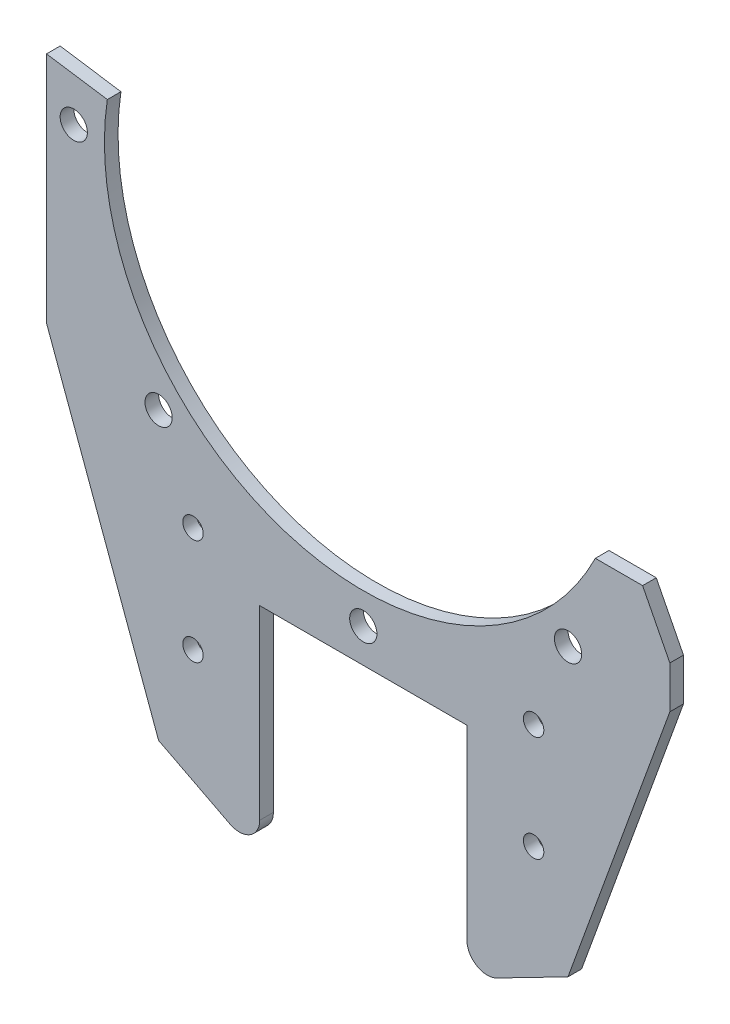
ISO-10303-21;
HEADER;
FILE_DESCRIPTION(('STEP AP214'),'2;1');
FILE_NAME('part.step','',(''),(''),'','','');
FILE_SCHEMA(('AUTOMOTIVE_DESIGN { 1 0 10303 214 1 1 1 1 }'));
ENDSEC;
DATA;
#1=APPLICATION_CONTEXT('core data for automotive mechanical design processes');
#2=APPLICATION_PROTOCOL_DEFINITION('international standard','automotive_design',2000,#1);
#3=PRODUCT_CONTEXT('',#1,'mechanical');
#4=PRODUCT('Part','Part','',(#3));
#5=PRODUCT_RELATED_PRODUCT_CATEGORY('part','',(#4));
#6=PRODUCT_DEFINITION_FORMATION('','',#4);
#7=PRODUCT_DEFINITION_CONTEXT('part definition',#1,'design');
#8=PRODUCT_DEFINITION('design','',#6,#7);
#9=PRODUCT_DEFINITION_SHAPE('','',#8);
#10=(LENGTH_UNIT() NAMED_UNIT(*) SI_UNIT(.MILLI.,.METRE.));
#11=(NAMED_UNIT(*) PLANE_ANGLE_UNIT() SI_UNIT($,.RADIAN.));
#12=(NAMED_UNIT(*) SI_UNIT($,.STERADIAN.) SOLID_ANGLE_UNIT());
#13=UNCERTAINTY_MEASURE_WITH_UNIT(LENGTH_MEASURE(1.E-05),#10,'distance_accuracy_value','');
#14=(GEOMETRIC_REPRESENTATION_CONTEXT(3) GLOBAL_UNCERTAINTY_ASSIGNED_CONTEXT((#13)) GLOBAL_UNIT_ASSIGNED_CONTEXT((#10,
#11,#12)) REPRESENTATION_CONTEXT('',''));
#15=CARTESIAN_POINT('',(0.,0.,0.));
#16=DIRECTION('',(0.,0.,1.));
#17=DIRECTION('',(1.,0.,0.));
#18=AXIS2_PLACEMENT_3D('',#15,#16,#17);
#19=CARTESIAN_POINT('',(0.,56.,2.));
#20=DIRECTION('',(0.,0.,1.));
#21=DIRECTION('',(1.,0.,0.));
#22=AXIS2_PLACEMENT_3D('',#19,#20,#21);
#23=PLANE('',#22);
#24=CARTESIAN_POINT('',(-42.5,56.,2.));
#25=DIRECTION('',(0.,0.,1.));
#26=DIRECTION('',(1.,0.,0.));
#27=AXIS2_PLACEMENT_3D('',#24,#25,#26);
#28=CIRCLE('',#27,2.);
#29=CARTESIAN_POINT('',(-40.5,56.,2.));
#30=VERTEX_POINT('',#29);
#31=EDGE_CURVE('E346',#30,#30,#28,.T.);
#32=ORIENTED_EDGE('',*,*,#31,.F.);
#33=EDGE_LOOP('',(#32));
#34=FACE_BOUND('',#33,.T.);
#35=CARTESIAN_POINT('',(24.9999999999944,-1.99021668527465,2.));
#36=DIRECTION('',(0.,0.,1.));
#37=DIRECTION('',(-1.,0.,0.));
#38=AXIS2_PLACEMENT_3D('',#35,#36,#37);
#39=CIRCLE('',#38,1.5);
#40=CARTESIAN_POINT('',(23.4999999999944,-1.99021668527465,2.));
#41=VERTEX_POINT('',#40);
#42=EDGE_CURVE('E358',#41,#41,#39,.T.);
#43=ORIENTED_EDGE('',*,*,#42,.F.);
#44=EDGE_LOOP('',(#43));
#45=FACE_BOUND('',#44,.T.);
#46=CARTESIAN_POINT('',(-30.0451203522419,25.9548796477583,2.));
#47=DIRECTION('',(0.,0.,1.));
#48=DIRECTION('',(1.,0.,0.));
#49=AXIS2_PLACEMENT_3D('',#46,#47,#48);
#50=CIRCLE('',#49,2.);
#51=CARTESIAN_POINT('',(-28.0451203522419,25.9548796477583,2.));
#52=VERTEX_POINT('',#51);
#53=EDGE_CURVE('E370',#52,#52,#50,.T.);
#54=ORIENTED_EDGE('',*,*,#53,.F.);
#55=EDGE_LOOP('',(#54));
#56=FACE_BOUND('',#55,.T.);
#57=CARTESIAN_POINT('',(-24.9999999999944,-1.99021668527465,2.));
#58=DIRECTION('',(0.,0.,1.));
#59=DIRECTION('',(1.,0.,0.));
#60=AXIS2_PLACEMENT_3D('',#57,#58,#59);
#61=CIRCLE('',#60,1.5);
#62=CARTESIAN_POINT('',(-23.4999999999944,-1.99021668527465,2.));
#63=VERTEX_POINT('',#62);
#64=EDGE_CURVE('E176',#63,#63,#61,.T.);
#65=ORIENTED_EDGE('',*,*,#64,.F.);
#66=EDGE_LOOP('',(#65));
#67=FACE_BOUND('',#66,.T.);
#68=DIRECTION('',(0.341401138398812,0.939917689321781,0.));
#69=VECTOR('',#68,1.);
#70=CARTESIAN_POINT('',(30.0451203522419,-16.0627680965737,2.));
#71=LINE('',#70,#69);
#72=CARTESIAN_POINT('',(30.0451203522419,-16.0627680965737,2.));
#73=VERTEX_POINT('',#72);
#74=CARTESIAN_POINT('',(44.9999999999948,25.1097833147259,2.));
#75=VERTEX_POINT('',#74);
#76=EDGE_CURVE('E202',#73,#75,#71,.T.);
#77=ORIENTED_EDGE('',*,*,#76,.T.);
#78=DIRECTION('',(0.,1.,0.));
#79=VECTOR('',#78,1.);
#80=CARTESIAN_POINT('',(44.9999999999948,25.1097833147259,2.));
#81=LINE('',#80,#79);
#82=CARTESIAN_POINT('',(44.9999999999946,31.3170511820597,2.));
#83=VERTEX_POINT('',#82);
#84=EDGE_CURVE('E114',#75,#83,#81,.T.);
#85=ORIENTED_EDGE('',*,*,#84,.T.);
#86=DIRECTION('',(-0.454677876394381,0.890655954180679,0.));
#87=VECTOR('',#86,1.);
#88=CARTESIAN_POINT('',(44.9999999999946,31.3170511820597,2.));
#89=LINE('',#88,#87);
#90=CARTESIAN_POINT('',(40.9999999999945,39.1525408807769,2.));
#91=VERTEX_POINT('',#90);
#92=EDGE_CURVE('E238',#83,#91,#89,.T.);
#93=ORIENTED_EDGE('',*,*,#92,.T.);
#94=DIRECTION('',(-1.,0.,0.));
#95=VECTOR('',#94,1.);
#96=CARTESIAN_POINT('',(34.061167349727,39.1525408807769,2.));
#97=LINE('',#96,#95);
#98=CARTESIAN_POINT('',(34.061167349727,39.1525408807769,2.));
#99=VERTEX_POINT('',#98);
#100=EDGE_CURVE('E257',#91,#99,#97,.T.);
#101=ORIENTED_EDGE('',*,*,#100,.T.);
#102=CARTESIAN_POINT('',(0.,56.,2.));
#103=DIRECTION('',(0.,0.,-1.));
#104=DIRECTION('',(1.,0.,0.));
#105=AXIS2_PLACEMENT_3D('',#102,#103,#104);
#106=CIRCLE('',#105,38.);
#107=CARTESIAN_POINT('',(-37.5766125260326,61.6566943587582,2.));
#108=VERTEX_POINT('',#107);
#109=EDGE_CURVE('E254',#99,#108,#106,.T.);
#110=ORIENTED_EDGE('',*,*,#109,.T.);
#111=DIRECTION('',(-0.98885822436928,0.148860377862059,0.));
#112=VECTOR('',#111,1.);
#113=CARTESIAN_POINT('',(-46.4999999999946,63.,2.));
#114=LINE('',#113,#112);
#115=CARTESIAN_POINT('',(-46.4999999999946,63.,2.));
#116=VERTEX_POINT('',#115);
#117=EDGE_CURVE('E256',#108,#116,#114,.T.);
#118=ORIENTED_EDGE('',*,*,#117,.T.);
#119=DIRECTION('',(0.,-1.,0.));
#120=VECTOR('',#119,1.);
#121=CARTESIAN_POINT('',(-46.4999999999946,63.,2.));
#122=LINE('',#121,#120);
#123=CARTESIAN_POINT('',(-46.4999999999946,28.7734947561586,2.));
#124=VERTEX_POINT('',#123);
#125=EDGE_CURVE('E259',#116,#124,#122,.T.);
#126=ORIENTED_EDGE('',*,*,#125,.T.);
#127=DIRECTION('',(0.344529942416553,-0.938775329234022,0.));
#128=VECTOR('',#127,1.);
#129=CARTESIAN_POINT('',(-46.4999999999946,28.7734947561586,2.));
#130=LINE('',#129,#128);
#131=CARTESIAN_POINT('',(-30.0451203522419,-16.0627680965737,2.));
#132=VERTEX_POINT('',#131);
#133=EDGE_CURVE('E265',#124,#132,#130,.T.);
#134=ORIENTED_EDGE('',*,*,#133,.T.);
#135=DIRECTION('',(0.889457038687271,-0.457018792096858,0.));
#136=VECTOR('',#135,1.);
#137=CARTESIAN_POINT('',(-30.0451203522419,-16.0627680965737,2.));
#138=LINE('',#137,#136);
#139=CARTESIAN_POINT('',(-19.5710563762906,-21.4445278201229,2.));
#140=VERTEX_POINT('',#139);
#141=EDGE_CURVE('E267',#132,#140,#138,.T.);
#142=ORIENTED_EDGE('',*,*,#141,.T.);
#143=CARTESIAN_POINT('',(-18.2,-18.7761567040611,2.));
#144=DIRECTION('',(0.,0.,1.));
#145=DIRECTION('',(-1.,0.,0.));
#146=AXIS2_PLACEMENT_3D('',#143,#144,#145);
#147=CIRCLE('',#146,3.);
#148=CARTESIAN_POINT('',(-15.2,-18.776156704061,2.));
#149=VERTEX_POINT('',#148);
#150=EDGE_CURVE('E269',#140,#149,#147,.T.);
#151=ORIENTED_EDGE('',*,*,#150,.T.);
#152=DIRECTION('',(0.,1.,0.));
#153=VECTOR('',#152,1.);
#154=CARTESIAN_POINT('',(-15.2,8.50978331472774,2.));
#155=LINE('',#154,#153);
#156=CARTESIAN_POINT('',(-15.2,8.50978331472774,2.));
#157=VERTEX_POINT('',#156);
#158=EDGE_CURVE('E271',#149,#157,#155,.T.);
#159=ORIENTED_EDGE('',*,*,#158,.T.);
#160=DIRECTION('',(1.,0.,0.));
#161=VECTOR('',#160,1.);
#162=CARTESIAN_POINT('',(0.,8.50978331472774,2.));
#163=LINE('',#162,#161);
#164=CARTESIAN_POINT('',(15.2,8.50978331472774,2.));
#165=VERTEX_POINT('',#164);
#166=EDGE_CURVE('E154',#157,#165,#163,.T.);
#167=ORIENTED_EDGE('',*,*,#166,.T.);
#168=DIRECTION('',(0.,-1.,0.));
#169=VECTOR('',#168,1.);
#170=CARTESIAN_POINT('',(15.2,8.50978331472774,2.));
#171=LINE('',#170,#169);
#172=CARTESIAN_POINT('',(15.2,-18.776156704061,2.));
#173=VERTEX_POINT('',#172);
#174=EDGE_CURVE('E148',#165,#173,#171,.T.);
#175=ORIENTED_EDGE('',*,*,#174,.T.);
#176=CARTESIAN_POINT('',(18.2,-18.7761567040611,2.));
#177=DIRECTION('',(0.,0.,1.));
#178=DIRECTION('',(1.,0.,0.));
#179=AXIS2_PLACEMENT_3D('',#176,#177,#178);
#180=CIRCLE('',#179,3.);
#181=CARTESIAN_POINT('',(19.5710563762906,-21.4445278201229,2.));
#182=VERTEX_POINT('',#181);
#183=EDGE_CURVE('E152',#173,#182,#180,.T.);
#184=ORIENTED_EDGE('',*,*,#183,.T.);
#185=DIRECTION('',(0.88945703868727,0.457018792096859,0.));
#186=VECTOR('',#185,1.);
#187=CARTESIAN_POINT('',(30.0451203522419,-16.0627680965737,2.));
#188=LINE('',#187,#186);
#189=EDGE_CURVE('E50',#182,#73,#188,.T.);
#190=ORIENTED_EDGE('',*,*,#189,.T.);
#191=EDGE_LOOP('',(#77,#85,#93,#101,#110,#118,#126,#134,#142,#151,#159,#167,#175,#184,#190));
#192=FACE_BOUND('',#191,.T.);
#193=CARTESIAN_POINT('',(-24.9999999999958,13.5097833147257,2.));
#194=DIRECTION('',(0.,0.,1.));
#195=DIRECTION('',(1.,0.,0.));
#196=AXIS2_PLACEMENT_3D('',#193,#194,#195);
#197=CIRCLE('',#196,1.50000000000189);
#198=CARTESIAN_POINT('',(-23.4999999999939,13.5097833147257,2.));
#199=VERTEX_POINT('',#198);
#200=EDGE_CURVE('E376',#199,#199,#197,.T.);
#201=ORIENTED_EDGE('',*,*,#200,.F.);
#202=EDGE_LOOP('',(#201));
#203=FACE_BOUND('',#202,.T.);
#204=CARTESIAN_POINT('',(24.9999999999958,13.5097833147257,2.));
#205=DIRECTION('',(0.,0.,1.));
#206=DIRECTION('',(-1.,0.,0.));
#207=AXIS2_PLACEMENT_3D('',#204,#205,#206);
#208=CIRCLE('',#207,1.50000000000189);
#209=CARTESIAN_POINT('',(23.4999999999939,13.5097833147257,2.));
#210=VERTEX_POINT('',#209);
#211=EDGE_CURVE('E364',#210,#210,#208,.T.);
#212=ORIENTED_EDGE('',*,*,#211,.F.);
#213=EDGE_LOOP('',(#212));
#214=FACE_BOUND('',#213,.T.);
#215=CARTESIAN_POINT('',(0.,13.5,2.));
#216=DIRECTION('',(0.,0.,1.));
#217=DIRECTION('',(1.,0.,0.));
#218=AXIS2_PLACEMENT_3D('',#215,#216,#217);
#219=CIRCLE('',#218,2.);
#220=CARTESIAN_POINT('',(2.,13.5,2.));
#221=VERTEX_POINT('',#220);
#222=EDGE_CURVE('E352',#221,#221,#219,.T.);
#223=ORIENTED_EDGE('',*,*,#222,.F.);
#224=EDGE_LOOP('',(#223));
#225=FACE_BOUND('',#224,.T.);
#226=CARTESIAN_POINT('',(30.0520382004283,25.9479617995717,2.));
#227=DIRECTION('',(0.,0.,1.));
#228=DIRECTION('',(1.,0.,0.));
#229=AXIS2_PLACEMENT_3D('',#226,#227,#228);
#230=CIRCLE('',#229,2.);
#231=CARTESIAN_POINT('',(32.0520382004283,25.9479617995717,2.));
#232=VERTEX_POINT('',#231);
#233=EDGE_CURVE('E337',#232,#232,#230,.T.);
#234=ORIENTED_EDGE('',*,*,#233,.F.);
#235=EDGE_LOOP('',(#234));
#236=FACE_BOUND('',#235,.T.);
#237=ADVANCED_FACE('F33',(#34,#45,#56,#67,#192,#203,#214,#225,#236),#23,.T.);
#238=CARTESIAN_POINT('',(0.,56.,0.));
#239=DIRECTION('',(0.,0.,1.));
#240=DIRECTION('',(1.,0.,0.));
#241=AXIS2_PLACEMENT_3D('',#238,#239,#240);
#242=PLANE('',#241);
#243=DIRECTION('',(0.341401138398812,0.939917689321781,0.));
#244=VECTOR('',#243,1.);
#245=CARTESIAN_POINT('',(30.0451203522419,-16.0627680965737,0.));
#246=LINE('',#245,#244);
#247=CARTESIAN_POINT('',(30.0451203522419,-16.0627680965737,0.));
#248=VERTEX_POINT('',#247);
#249=CARTESIAN_POINT('',(44.9999999999948,25.1097833147259,0.));
#250=VERTEX_POINT('',#249);
#251=EDGE_CURVE('E172',#248,#250,#246,.T.);
#252=ORIENTED_EDGE('',*,*,#251,.F.);
#253=DIRECTION('',(0.88945703868727,0.457018792096859,0.));
#254=VECTOR('',#253,1.);
#255=CARTESIAN_POINT('',(30.0451203522419,-16.0627680965737,0.));
#256=LINE('',#255,#254);
#257=CARTESIAN_POINT('',(19.5710563762906,-21.4445278201229,0.));
#258=VERTEX_POINT('',#257);
#259=EDGE_CURVE('E106',#258,#248,#256,.T.);
#260=ORIENTED_EDGE('',*,*,#259,.F.);
#261=CARTESIAN_POINT('',(18.2,-18.7761567040611,0.));
#262=DIRECTION('',(0.,0.,1.));
#263=DIRECTION('',(1.,0.,0.));
#264=AXIS2_PLACEMENT_3D('',#261,#262,#263);
#265=CIRCLE('',#264,3.);
#266=CARTESIAN_POINT('',(15.2,-18.776156704061,0.));
#267=VERTEX_POINT('',#266);
#268=EDGE_CURVE('E100',#267,#258,#265,.T.);
#269=ORIENTED_EDGE('',*,*,#268,.F.);
#270=DIRECTION('',(0.,-1.,0.));
#271=VECTOR('',#270,1.);
#272=CARTESIAN_POINT('',(15.2,8.50978331472774,0.));
#273=LINE('',#272,#271);
#274=CARTESIAN_POINT('',(15.2,8.50978331472774,0.));
#275=VERTEX_POINT('',#274);
#276=EDGE_CURVE('E162',#275,#267,#273,.T.);
#277=ORIENTED_EDGE('',*,*,#276,.F.);
#278=DIRECTION('',(1.,0.,0.));
#279=VECTOR('',#278,1.);
#280=CARTESIAN_POINT('',(0.,8.50978331472774,0.));
#281=LINE('',#280,#279);
#282=CARTESIAN_POINT('',(-15.2,8.50978331472774,0.));
#283=VERTEX_POINT('',#282);
#284=EDGE_CURVE('E197',#283,#275,#281,.T.);
#285=ORIENTED_EDGE('',*,*,#284,.F.);
#286=DIRECTION('',(0.,1.,0.));
#287=VECTOR('',#286,1.);
#288=CARTESIAN_POINT('',(-15.2,8.50978331472774,0.));
#289=LINE('',#288,#287);
#290=CARTESIAN_POINT('',(-15.2,-18.776156704061,0.));
#291=VERTEX_POINT('',#290);
#292=EDGE_CURVE('E194',#291,#283,#289,.T.);
#293=ORIENTED_EDGE('',*,*,#292,.F.);
#294=CARTESIAN_POINT('',(-18.2,-18.7761567040611,0.));
#295=DIRECTION('',(0.,0.,1.));
#296=DIRECTION('',(-1.,0.,0.));
#297=AXIS2_PLACEMENT_3D('',#294,#295,#296);
#298=CIRCLE('',#297,3.);
#299=CARTESIAN_POINT('',(-19.5710563762906,-21.4445278201229,0.));
#300=VERTEX_POINT('',#299);
#301=EDGE_CURVE('E192',#300,#291,#298,.T.);
#302=ORIENTED_EDGE('',*,*,#301,.F.);
#303=DIRECTION('',(0.889457038687271,-0.457018792096858,0.));
#304=VECTOR('',#303,1.);
#305=CARTESIAN_POINT('',(-30.0451203522419,-16.0627680965737,0.));
#306=LINE('',#305,#304);
#307=CARTESIAN_POINT('',(-30.0451203522419,-16.0627680965737,0.));
#308=VERTEX_POINT('',#307);
#309=EDGE_CURVE('E190',#308,#300,#306,.T.);
#310=ORIENTED_EDGE('',*,*,#309,.F.);
#311=DIRECTION('',(0.344529942416553,-0.938775329234022,0.));
#312=VECTOR('',#311,1.);
#313=CARTESIAN_POINT('',(-46.4999999999946,28.7734947561586,0.));
#314=LINE('',#313,#312);
#315=CARTESIAN_POINT('',(-46.4999999999946,28.7734947561586,0.));
#316=VERTEX_POINT('',#315);
#317=EDGE_CURVE('E188',#316,#308,#314,.T.);
#318=ORIENTED_EDGE('',*,*,#317,.F.);
#319=DIRECTION('',(0.,-1.,0.));
#320=VECTOR('',#319,1.);
#321=CARTESIAN_POINT('',(-46.4999999999946,63.,0.));
#322=LINE('',#321,#320);
#323=CARTESIAN_POINT('',(-46.4999999999946,63.,0.));
#324=VERTEX_POINT('',#323);
#325=EDGE_CURVE('E186',#324,#316,#322,.T.);
#326=ORIENTED_EDGE('',*,*,#325,.F.);
#327=DIRECTION('',(-0.98885822436928,0.148860377862059,0.));
#328=VECTOR('',#327,1.);
#329=CARTESIAN_POINT('',(-46.4999999999946,63.,0.));
#330=LINE('',#329,#328);
#331=CARTESIAN_POINT('',(-37.5766125260326,61.6566943587582,0.));
#332=VERTEX_POINT('',#331);
#333=EDGE_CURVE('E184',#332,#324,#330,.T.);
#334=ORIENTED_EDGE('',*,*,#333,.F.);
#335=CARTESIAN_POINT('',(0.,56.,0.));
#336=DIRECTION('',(0.,0.,-1.));
#337=DIRECTION('',(1.,0.,0.));
#338=AXIS2_PLACEMENT_3D('',#335,#336,#337);
#339=CIRCLE('',#338,38.);
#340=CARTESIAN_POINT('',(34.061167349727,39.1525408807769,0.));
#341=VERTEX_POINT('',#340);
#342=EDGE_CURVE('E182',#341,#332,#339,.T.);
#343=ORIENTED_EDGE('',*,*,#342,.F.);
#344=DIRECTION('',(-1.,0.,0.));
#345=VECTOR('',#344,1.);
#346=CARTESIAN_POINT('',(34.061167349727,39.1525408807769,0.));
#347=LINE('',#346,#345);
#348=CARTESIAN_POINT('',(40.9999999999945,39.1525408807769,0.));
#349=VERTEX_POINT('',#348);
#350=EDGE_CURVE('E180',#349,#341,#347,.T.);
#351=ORIENTED_EDGE('',*,*,#350,.F.);
#352=DIRECTION('',(-0.454677876394381,0.890655954180679,0.));
#353=VECTOR('',#352,1.);
#354=CARTESIAN_POINT('',(44.9999999999946,31.3170511820597,0.));
#355=LINE('',#354,#353);
#356=CARTESIAN_POINT('',(44.9999999999946,31.3170511820597,0.));
#357=VERTEX_POINT('',#356);
#358=EDGE_CURVE('E178',#357,#349,#355,.T.);
#359=ORIENTED_EDGE('',*,*,#358,.F.);
#360=DIRECTION('',(0.,1.,0.));
#361=VECTOR('',#360,1.);
#362=CARTESIAN_POINT('',(44.9999999999948,25.1097833147259,0.));
#363=LINE('',#362,#361);
#364=EDGE_CURVE('E175',#250,#357,#363,.T.);
#365=ORIENTED_EDGE('',*,*,#364,.F.);
#366=EDGE_LOOP('',(#252,#260,#269,#277,#285,#293,#302,#310,#318,#326,#334,#343,#351,#359,#365));
#367=FACE_BOUND('',#366,.T.);
#368=CARTESIAN_POINT('',(-24.9999999999944,-1.99021668527465,0.));
#369=DIRECTION('',(0.,0.,1.));
#370=DIRECTION('',(1.,0.,0.));
#371=AXIS2_PLACEMENT_3D('',#368,#369,#370);
#372=CIRCLE('',#371,1.5);
#373=CARTESIAN_POINT('',(-23.4999999999944,-1.99021668527465,0.));
#374=VERTEX_POINT('',#373);
#375=EDGE_CURVE('E379',#374,#374,#372,.T.);
#376=ORIENTED_EDGE('',*,*,#375,.T.);
#377=EDGE_LOOP('',(#376));
#378=FACE_BOUND('',#377,.T.);
#379=CARTESIAN_POINT('',(-24.9999999999958,13.5097833147257,0.));
#380=DIRECTION('',(0.,0.,1.));
#381=DIRECTION('',(1.,0.,0.));
#382=AXIS2_PLACEMENT_3D('',#379,#380,#381);
#383=CIRCLE('',#382,1.50000000000189);
#384=CARTESIAN_POINT('',(-23.4999999999939,13.5097833147257,0.));
#385=VERTEX_POINT('',#384);
#386=EDGE_CURVE('E373',#385,#385,#383,.T.);
#387=ORIENTED_EDGE('',*,*,#386,.T.);
#388=EDGE_LOOP('',(#387));
#389=FACE_BOUND('',#388,.T.);
#390=CARTESIAN_POINT('',(-30.0451203522419,25.9548796477583,0.));
#391=DIRECTION('',(0.,0.,1.));
#392=DIRECTION('',(1.,0.,0.));
#393=AXIS2_PLACEMENT_3D('',#390,#391,#392);
#394=CIRCLE('',#393,2.);
#395=CARTESIAN_POINT('',(-28.0451203522419,25.9548796477583,0.));
#396=VERTEX_POINT('',#395);
#397=EDGE_CURVE('E367',#396,#396,#394,.T.);
#398=ORIENTED_EDGE('',*,*,#397,.T.);
#399=EDGE_LOOP('',(#398));
#400=FACE_BOUND('',#399,.T.);
#401=CARTESIAN_POINT('',(24.9999999999958,13.5097833147257,0.));
#402=DIRECTION('',(0.,0.,1.));
#403=DIRECTION('',(-1.,0.,0.));
#404=AXIS2_PLACEMENT_3D('',#401,#402,#403);
#405=CIRCLE('',#404,1.50000000000189);
#406=CARTESIAN_POINT('',(23.4999999999939,13.5097833147257,0.));
#407=VERTEX_POINT('',#406);
#408=EDGE_CURVE('E361',#407,#407,#405,.T.);
#409=ORIENTED_EDGE('',*,*,#408,.T.);
#410=EDGE_LOOP('',(#409));
#411=FACE_BOUND('',#410,.T.);
#412=CARTESIAN_POINT('',(24.9999999999944,-1.99021668527465,0.));
#413=DIRECTION('',(0.,0.,1.));
#414=DIRECTION('',(-1.,0.,0.));
#415=AXIS2_PLACEMENT_3D('',#412,#413,#414);
#416=CIRCLE('',#415,1.5);
#417=CARTESIAN_POINT('',(23.4999999999944,-1.99021668527465,0.));
#418=VERTEX_POINT('',#417);
#419=EDGE_CURVE('E355',#418,#418,#416,.T.);
#420=ORIENTED_EDGE('',*,*,#419,.T.);
#421=EDGE_LOOP('',(#420));
#422=FACE_BOUND('',#421,.T.);
#423=CARTESIAN_POINT('',(0.,13.5,0.));
#424=DIRECTION('',(0.,0.,1.));
#425=DIRECTION('',(1.,0.,0.));
#426=AXIS2_PLACEMENT_3D('',#423,#424,#425);
#427=CIRCLE('',#426,2.);
#428=CARTESIAN_POINT('',(2.,13.5,0.));
#429=VERTEX_POINT('',#428);
#430=EDGE_CURVE('E349',#429,#429,#427,.T.);
#431=ORIENTED_EDGE('',*,*,#430,.T.);
#432=EDGE_LOOP('',(#431));
#433=FACE_BOUND('',#432,.T.);
#434=CARTESIAN_POINT('',(-42.5,56.,0.));
#435=DIRECTION('',(0.,0.,1.));
#436=DIRECTION('',(1.,0.,0.));
#437=AXIS2_PLACEMENT_3D('',#434,#435,#436);
#438=CIRCLE('',#437,2.);
#439=CARTESIAN_POINT('',(-40.5,56.,0.));
#440=VERTEX_POINT('',#439);
#441=EDGE_CURVE('E343',#440,#440,#438,.T.);
#442=ORIENTED_EDGE('',*,*,#441,.T.);
#443=EDGE_LOOP('',(#442));
#444=FACE_BOUND('',#443,.T.);
#445=CARTESIAN_POINT('',(30.0520382004283,25.9479617995717,0.));
#446=DIRECTION('',(0.,0.,1.));
#447=DIRECTION('',(1.,0.,0.));
#448=AXIS2_PLACEMENT_3D('',#445,#446,#447);
#449=CIRCLE('',#448,2.);
#450=CARTESIAN_POINT('',(32.0520382004283,25.9479617995717,0.));
#451=VERTEX_POINT('',#450);
#452=EDGE_CURVE('E340',#451,#451,#449,.T.);
#453=ORIENTED_EDGE('',*,*,#452,.T.);
#454=EDGE_LOOP('',(#453));
#455=FACE_BOUND('',#454,.T.);
#456=ADVANCED_FACE('F242',(#367,#378,#389,#400,#411,#422,#433,#444,#455),#242,.F.);
#457=CARTESIAN_POINT('',(30.0451203522419,-16.0627680965737,2.));
#458=DIRECTION('',(-0.939917689321781,0.341401138398812,0.));
#459=DIRECTION('',(-0.341401138398812,-0.939917689321781,0.));
#460=AXIS2_PLACEMENT_3D('',#457,#458,#459);
#461=PLANE('',#460);
#462=ORIENTED_EDGE('',*,*,#251,.T.);
#463=DIRECTION('',(0.,0.,-1.));
#464=VECTOR('',#463,1.);
#465=CARTESIAN_POINT('',(44.9999999999948,25.1097833147259,2.));
#466=LINE('',#465,#464);
#467=EDGE_CURVE('E11',#75,#250,#466,.T.);
#468=ORIENTED_EDGE('',*,*,#467,.F.);
#469=ORIENTED_EDGE('',*,*,#76,.F.);
#470=DIRECTION('',(0.,0.,-1.));
#471=VECTOR('',#470,1.);
#472=CARTESIAN_POINT('',(30.0451203522419,-16.0627680965737,2.));
#473=LINE('',#472,#471);
#474=EDGE_CURVE('E168',#73,#248,#473,.T.);
#475=ORIENTED_EDGE('',*,*,#474,.T.);
#476=EDGE_LOOP('',(#462,#468,#469,#475));
#477=FACE_BOUND('',#476,.T.);
#478=ADVANCED_FACE('F35',(#477),#461,.F.);
#479=CARTESIAN_POINT('',(44.9999999999948,25.1097833147259,2.));
#480=DIRECTION('',(-1.,0.,0.));
#481=DIRECTION('',(0.,-1.,0.));
#482=AXIS2_PLACEMENT_3D('',#479,#480,#481);
#483=PLANE('',#482);
#484=ORIENTED_EDGE('',*,*,#364,.T.);
#485=DIRECTION('',(0.,0.,-1.));
#486=VECTOR('',#485,1.);
#487=CARTESIAN_POINT('',(44.9999999999946,31.3170511820597,2.));
#488=LINE('',#487,#486);
#489=EDGE_CURVE('E42',#83,#357,#488,.T.);
#490=ORIENTED_EDGE('',*,*,#489,.F.);
#491=ORIENTED_EDGE('',*,*,#84,.F.);
#492=ORIENTED_EDGE('',*,*,#467,.T.);
#493=EDGE_LOOP('',(#484,#490,#491,#492));
#494=FACE_BOUND('',#493,.T.);
#495=ADVANCED_FACE('F556',(#494),#483,.F.);
#496=CARTESIAN_POINT('',(44.9999999999946,31.3170511820597,2.));
#497=DIRECTION('',(-0.890655954180679,-0.454677876394381,0.));
#498=DIRECTION('',(0.454677876394381,-0.890655954180679,0.));
#499=AXIS2_PLACEMENT_3D('',#496,#497,#498);
#500=PLANE('',#499);
#501=ORIENTED_EDGE('',*,*,#358,.T.);
#502=DIRECTION('',(0.,0.,-1.));
#503=VECTOR('',#502,1.);
#504=CARTESIAN_POINT('',(40.9999999999945,39.1525408807769,2.));
#505=LINE('',#504,#503);
#506=EDGE_CURVE('E230',#91,#349,#505,.T.);
#507=ORIENTED_EDGE('',*,*,#506,.F.);
#508=ORIENTED_EDGE('',*,*,#92,.F.);
#509=ORIENTED_EDGE('',*,*,#489,.T.);
#510=EDGE_LOOP('',(#501,#507,#508,#509));
#511=FACE_BOUND('',#510,.T.);
#512=ADVANCED_FACE('F236',(#511),#500,.F.);
#513=CARTESIAN_POINT('',(34.061167349727,39.1525408807769,2.));
#514=DIRECTION('',(0.,-1.,0.));
#515=DIRECTION('',(0.,0.,-1.));
#516=AXIS2_PLACEMENT_3D('',#513,#514,#515);
#517=PLANE('',#516);
#518=ORIENTED_EDGE('',*,*,#350,.T.);
#519=DIRECTION('',(0.,0.,-1.));
#520=VECTOR('',#519,1.);
#521=CARTESIAN_POINT('',(34.061167349727,39.1525408807769,2.));
#522=LINE('',#521,#520);
#523=EDGE_CURVE('E227',#99,#341,#522,.T.);
#524=ORIENTED_EDGE('',*,*,#523,.F.);
#525=ORIENTED_EDGE('',*,*,#100,.F.);
#526=ORIENTED_EDGE('',*,*,#506,.T.);
#527=EDGE_LOOP('',(#518,#524,#525,#526));
#528=FACE_BOUND('',#527,.T.);
#529=ADVANCED_FACE('F248',(#528),#517,.F.);
#530=CARTESIAN_POINT('',(0.,56.,2.));
#531=DIRECTION('',(0.,0.,-1.));
#532=DIRECTION('',(-1.,0.,0.));
#533=AXIS2_PLACEMENT_3D('',#530,#531,#532);
#534=CYLINDRICAL_SURFACE('',#533,38.);
#535=ORIENTED_EDGE('',*,*,#342,.T.);
#536=DIRECTION('',(0.,0.,-1.));
#537=VECTOR('',#536,1.);
#538=CARTESIAN_POINT('',(-37.5766125260326,61.6566943587582,2.));
#539=LINE('',#538,#537);
#540=EDGE_CURVE('E224',#108,#332,#539,.T.);
#541=ORIENTED_EDGE('',*,*,#540,.F.);
#542=ORIENTED_EDGE('',*,*,#109,.F.);
#543=ORIENTED_EDGE('',*,*,#523,.T.);
#544=EDGE_LOOP('',(#535,#541,#542,#543));
#545=FACE_BOUND('',#544,.T.);
#546=ADVANCED_FACE('F252',(#545),#534,.F.);
#547=CARTESIAN_POINT('',(-46.4999999999946,63.,2.));
#548=DIRECTION('',(-0.148860377862059,-0.98885822436928,0.));
#549=DIRECTION('',(0.98885822436928,-0.148860377862059,0.));
#550=AXIS2_PLACEMENT_3D('',#547,#548,#549);
#551=PLANE('',#550);
#552=ORIENTED_EDGE('',*,*,#333,.T.);
#553=DIRECTION('',(0.,0.,-1.));
#554=VECTOR('',#553,1.);
#555=CARTESIAN_POINT('',(-46.4999999999946,63.,2.));
#556=LINE('',#555,#554);
#557=EDGE_CURVE('E221',#116,#324,#556,.T.);
#558=ORIENTED_EDGE('',*,*,#557,.F.);
#559=ORIENTED_EDGE('',*,*,#117,.F.);
#560=ORIENTED_EDGE('',*,*,#540,.T.);
#561=EDGE_LOOP('',(#552,#558,#559,#560));
#562=FACE_BOUND('',#561,.T.);
#563=ADVANCED_FACE('F521',(#562),#551,.F.);
#564=CARTESIAN_POINT('',(-46.4999999999946,63.,2.));
#565=DIRECTION('',(1.,0.,0.));
#566=DIRECTION('',(0.,0.,-1.));
#567=AXIS2_PLACEMENT_3D('',#564,#565,#566);
#568=PLANE('',#567);
#569=ORIENTED_EDGE('',*,*,#325,.T.);
#570=DIRECTION('',(0.,0.,-1.));
#571=VECTOR('',#570,1.);
#572=CARTESIAN_POINT('',(-46.4999999999946,28.7734947561586,2.));
#573=LINE('',#572,#571);
#574=EDGE_CURVE('E218',#124,#316,#573,.T.);
#575=ORIENTED_EDGE('',*,*,#574,.F.);
#576=ORIENTED_EDGE('',*,*,#125,.F.);
#577=ORIENTED_EDGE('',*,*,#557,.T.);
#578=EDGE_LOOP('',(#569,#575,#576,#577));
#579=FACE_BOUND('',#578,.T.);
#580=ADVANCED_FACE('F511',(#579),#568,.F.);
#581=CARTESIAN_POINT('',(-46.4999999999946,28.7734947561586,2.));
#582=DIRECTION('',(0.938775329234022,0.344529942416553,0.));
#583=DIRECTION('',(-0.344529942416553,0.938775329234023,0.));
#584=AXIS2_PLACEMENT_3D('',#581,#582,#583);
#585=PLANE('',#584);
#586=ORIENTED_EDGE('',*,*,#317,.T.);
#587=DIRECTION('',(0.,0.,-1.));
#588=VECTOR('',#587,1.);
#589=CARTESIAN_POINT('',(-30.0451203522419,-16.0627680965737,2.));
#590=LINE('',#589,#588);
#591=EDGE_CURVE('E215',#132,#308,#590,.T.);
#592=ORIENTED_EDGE('',*,*,#591,.F.);
#593=ORIENTED_EDGE('',*,*,#133,.F.);
#594=ORIENTED_EDGE('',*,*,#574,.T.);
#595=EDGE_LOOP('',(#586,#592,#593,#594));
#596=FACE_BOUND('',#595,.T.);
#597=ADVANCED_FACE('F501',(#596),#585,.F.);
#598=CARTESIAN_POINT('',(-30.0451203522419,-16.0627680965737,2.));
#599=DIRECTION('',(0.457018792096858,0.889457038687271,0.));
#600=DIRECTION('',(-0.889457038687271,0.457018792096858,0.));
#601=AXIS2_PLACEMENT_3D('',#598,#599,#600);
#602=PLANE('',#601);
#603=ORIENTED_EDGE('',*,*,#309,.T.);
#604=DIRECTION('',(0.,0.,-1.));
#605=VECTOR('',#604,1.);
#606=CARTESIAN_POINT('',(-19.5710563762906,-21.4445278201229,2.));
#607=LINE('',#606,#605);
#608=EDGE_CURVE('E212',#140,#300,#607,.T.);
#609=ORIENTED_EDGE('',*,*,#608,.F.);
#610=ORIENTED_EDGE('',*,*,#141,.F.);
#611=ORIENTED_EDGE('',*,*,#591,.T.);
#612=EDGE_LOOP('',(#603,#609,#610,#611));
#613=FACE_BOUND('',#612,.T.);
#614=ADVANCED_FACE('F491',(#613),#602,.F.);
#615=CARTESIAN_POINT('',(-18.2,-18.7761567040611,2.));
#616=DIRECTION('',(0.,0.,-1.));
#617=DIRECTION('',(-1.,0.,0.));
#618=AXIS2_PLACEMENT_3D('',#615,#616,#617);
#619=CYLINDRICAL_SURFACE('',#618,3.);
#620=ORIENTED_EDGE('',*,*,#301,.T.);
#621=DIRECTION('',(0.,0.,-1.));
#622=VECTOR('',#621,1.);
#623=CARTESIAN_POINT('',(-15.2,-18.776156704061,2.));
#624=LINE('',#623,#622);
#625=EDGE_CURVE('E209',#149,#291,#624,.T.);
#626=ORIENTED_EDGE('',*,*,#625,.F.);
#627=ORIENTED_EDGE('',*,*,#150,.F.);
#628=ORIENTED_EDGE('',*,*,#608,.T.);
#629=EDGE_LOOP('',(#620,#626,#627,#628));
#630=FACE_BOUND('',#629,.T.);
#631=ADVANCED_FACE('F482',(#630),#619,.T.);
#632=CARTESIAN_POINT('',(-15.2,8.50978331472774,2.));
#633=DIRECTION('',(-1.,0.,0.));
#634=DIRECTION('',(0.,0.,1.));
#635=AXIS2_PLACEMENT_3D('',#632,#633,#634);
#636=PLANE('',#635);
#637=ORIENTED_EDGE('',*,*,#292,.T.);
#638=DIRECTION('',(0.,0.,-1.));
#639=VECTOR('',#638,1.);
#640=CARTESIAN_POINT('',(-15.2,8.50978331472774,2.));
#641=LINE('',#640,#639);
#642=EDGE_CURVE('E206',#157,#283,#641,.T.);
#643=ORIENTED_EDGE('',*,*,#642,.F.);
#644=ORIENTED_EDGE('',*,*,#158,.F.);
#645=ORIENTED_EDGE('',*,*,#625,.T.);
#646=EDGE_LOOP('',(#637,#643,#644,#645));
#647=FACE_BOUND('',#646,.T.);
#648=ADVANCED_FACE('F277',(#647),#636,.F.);
#649=CARTESIAN_POINT('',(0.,8.50978331472774,2.));
#650=DIRECTION('',(0.,1.,0.));
#651=DIRECTION('',(0.,0.,1.));
#652=AXIS2_PLACEMENT_3D('',#649,#650,#651);
#653=PLANE('',#652);
#654=ORIENTED_EDGE('',*,*,#284,.T.);
#655=DIRECTION('',(0.,0.,-1.));
#656=VECTOR('',#655,1.);
#657=CARTESIAN_POINT('',(15.2,8.50978331472774,2.));
#658=LINE('',#657,#656);
#659=EDGE_CURVE('E163',#165,#275,#658,.T.);
#660=ORIENTED_EDGE('',*,*,#659,.F.);
#661=ORIENTED_EDGE('',*,*,#166,.F.);
#662=ORIENTED_EDGE('',*,*,#642,.T.);
#663=EDGE_LOOP('',(#654,#660,#661,#662));
#664=FACE_BOUND('',#663,.T.);
#665=ADVANCED_FACE('F280',(#664),#653,.F.);
#666=CARTESIAN_POINT('',(15.2,8.50978331472774,2.));
#667=DIRECTION('',(1.,0.,0.));
#668=DIRECTION('',(0.,1.,0.));
#669=AXIS2_PLACEMENT_3D('',#666,#667,#668);
#670=PLANE('',#669);
#671=ORIENTED_EDGE('',*,*,#276,.T.);
#672=DIRECTION('',(0.,0.,-1.));
#673=VECTOR('',#672,1.);
#674=CARTESIAN_POINT('',(15.2,-18.776156704061,2.));
#675=LINE('',#674,#673);
#676=EDGE_CURVE('E159',#173,#267,#675,.T.);
#677=ORIENTED_EDGE('',*,*,#676,.F.);
#678=ORIENTED_EDGE('',*,*,#174,.F.);
#679=ORIENTED_EDGE('',*,*,#659,.T.);
#680=EDGE_LOOP('',(#671,#677,#678,#679));
#681=FACE_BOUND('',#680,.T.);
#682=ADVANCED_FACE('F160',(#681),#670,.F.);
#683=CARTESIAN_POINT('',(18.2,-18.7761567040611,2.));
#684=DIRECTION('',(0.,0.,-1.));
#685=DIRECTION('',(-1.,0.,0.));
#686=AXIS2_PLACEMENT_3D('',#683,#684,#685);
#687=CYLINDRICAL_SURFACE('',#686,3.);
#688=ORIENTED_EDGE('',*,*,#268,.T.);
#689=DIRECTION('',(0.,0.,-1.));
#690=VECTOR('',#689,1.);
#691=CARTESIAN_POINT('',(19.5710563762906,-21.4445278201229,2.));
#692=LINE('',#691,#690);
#693=EDGE_CURVE('E164',#182,#258,#692,.T.);
#694=ORIENTED_EDGE('',*,*,#693,.F.);
#695=ORIENTED_EDGE('',*,*,#183,.F.);
#696=ORIENTED_EDGE('',*,*,#676,.T.);
#697=EDGE_LOOP('',(#688,#694,#695,#696));
#698=FACE_BOUND('',#697,.T.);
#699=ADVANCED_FACE('F166',(#698),#687,.T.);
#700=CARTESIAN_POINT('',(30.0451203522419,-16.0627680965737,2.));
#701=DIRECTION('',(-0.457018792096859,0.88945703868727,0.));
#702=DIRECTION('',(-0.88945703868727,-0.457018792096859,0.));
#703=AXIS2_PLACEMENT_3D('',#700,#701,#702);
#704=PLANE('',#703);
#705=ORIENTED_EDGE('',*,*,#259,.T.);
#706=ORIENTED_EDGE('',*,*,#474,.F.);
#707=ORIENTED_EDGE('',*,*,#189,.F.);
#708=ORIENTED_EDGE('',*,*,#693,.T.);
#709=EDGE_LOOP('',(#705,#706,#707,#708));
#710=FACE_BOUND('',#709,.T.);
#711=ADVANCED_FACE('F284',(#710),#704,.F.);
#712=CARTESIAN_POINT('',(-24.9999999999944,-1.99021668527465,2.));
#713=DIRECTION('',(0.,0.,-1.));
#714=DIRECTION('',(-1.,0.,0.));
#715=AXIS2_PLACEMENT_3D('',#712,#713,#714);
#716=CYLINDRICAL_SURFACE('',#715,1.5);
#717=ORIENTED_EDGE('',*,*,#64,.T.);
#718=EDGE_LOOP('',(#717));
#719=FACE_BOUND('',#718,.T.);
#720=ORIENTED_EDGE('',*,*,#375,.F.);
#721=EDGE_LOOP('',(#720));
#722=FACE_BOUND('',#721,.T.);
#723=ADVANCED_FACE('F286',(#719,#722),#716,.F.);
#724=CARTESIAN_POINT('',(-24.9999999999958,13.5097833147257,2.));
#725=DIRECTION('',(0.,0.,-1.));
#726=DIRECTION('',(-1.,0.,0.));
#727=AXIS2_PLACEMENT_3D('',#724,#725,#726);
#728=CYLINDRICAL_SURFACE('',#727,1.50000000000189);
#729=ORIENTED_EDGE('',*,*,#200,.T.);
#730=EDGE_LOOP('',(#729));
#731=FACE_BOUND('',#730,.T.);
#732=ORIENTED_EDGE('',*,*,#386,.F.);
#733=EDGE_LOOP('',(#732));
#734=FACE_BOUND('',#733,.T.);
#735=ADVANCED_FACE('F292',(#731,#734),#728,.F.);
#736=CARTESIAN_POINT('',(-30.0451203522419,25.9548796477583,2.));
#737=DIRECTION('',(0.,0.,-1.));
#738=DIRECTION('',(-1.,0.,0.));
#739=AXIS2_PLACEMENT_3D('',#736,#737,#738);
#740=CYLINDRICAL_SURFACE('',#739,2.);
#741=ORIENTED_EDGE('',*,*,#53,.T.);
#742=EDGE_LOOP('',(#741));
#743=FACE_BOUND('',#742,.T.);
#744=ORIENTED_EDGE('',*,*,#397,.F.);
#745=EDGE_LOOP('',(#744));
#746=FACE_BOUND('',#745,.T.);
#747=ADVANCED_FACE('F308',(#743,#746),#740,.F.);
#748=CARTESIAN_POINT('',(24.9999999999958,13.5097833147257,2.));
#749=DIRECTION('',(0.,0.,-1.));
#750=DIRECTION('',(-1.,0.,0.));
#751=AXIS2_PLACEMENT_3D('',#748,#749,#750);
#752=CYLINDRICAL_SURFACE('',#751,1.50000000000189);
#753=ORIENTED_EDGE('',*,*,#211,.T.);
#754=EDGE_LOOP('',(#753));
#755=FACE_BOUND('',#754,.T.);
#756=ORIENTED_EDGE('',*,*,#408,.F.);
#757=EDGE_LOOP('',(#756));
#758=FACE_BOUND('',#757,.T.);
#759=ADVANCED_FACE('F312',(#755,#758),#752,.F.);
#760=CARTESIAN_POINT('',(24.9999999999944,-1.99021668527465,2.));
#761=DIRECTION('',(0.,0.,-1.));
#762=DIRECTION('',(-1.,0.,0.));
#763=AXIS2_PLACEMENT_3D('',#760,#761,#762);
#764=CYLINDRICAL_SURFACE('',#763,1.5);
#765=ORIENTED_EDGE('',*,*,#42,.T.);
#766=EDGE_LOOP('',(#765));
#767=FACE_BOUND('',#766,.T.);
#768=ORIENTED_EDGE('',*,*,#419,.F.);
#769=EDGE_LOOP('',(#768));
#770=FACE_BOUND('',#769,.T.);
#771=ADVANCED_FACE('F316',(#767,#770),#764,.F.);
#772=CARTESIAN_POINT('',(0.,13.5,2.));
#773=DIRECTION('',(0.,0.,-1.));
#774=DIRECTION('',(-1.,0.,0.));
#775=AXIS2_PLACEMENT_3D('',#772,#773,#774);
#776=CYLINDRICAL_SURFACE('',#775,2.);
#777=ORIENTED_EDGE('',*,*,#222,.T.);
#778=EDGE_LOOP('',(#777));
#779=FACE_BOUND('',#778,.T.);
#780=ORIENTED_EDGE('',*,*,#430,.F.);
#781=EDGE_LOOP('',(#780));
#782=FACE_BOUND('',#781,.T.);
#783=ADVANCED_FACE('F320',(#779,#782),#776,.F.);
#784=CARTESIAN_POINT('',(-42.5,56.,2.));
#785=DIRECTION('',(0.,0.,-1.));
#786=DIRECTION('',(-1.,0.,0.));
#787=AXIS2_PLACEMENT_3D('',#784,#785,#786);
#788=CYLINDRICAL_SURFACE('',#787,2.);
#789=ORIENTED_EDGE('',*,*,#31,.T.);
#790=EDGE_LOOP('',(#789));
#791=FACE_BOUND('',#790,.T.);
#792=ORIENTED_EDGE('',*,*,#441,.F.);
#793=EDGE_LOOP('',(#792));
#794=FACE_BOUND('',#793,.T.);
#795=ADVANCED_FACE('F324',(#791,#794),#788,.F.);
#796=CARTESIAN_POINT('',(30.0520382004283,25.9479617995717,2.));
#797=DIRECTION('',(0.,0.,-1.));
#798=DIRECTION('',(-1.,0.,0.));
#799=AXIS2_PLACEMENT_3D('',#796,#797,#798);
#800=CYLINDRICAL_SURFACE('',#799,2.);
#801=ORIENTED_EDGE('',*,*,#233,.T.);
#802=EDGE_LOOP('',(#801));
#803=FACE_BOUND('',#802,.T.);
#804=ORIENTED_EDGE('',*,*,#452,.F.);
#805=EDGE_LOOP('',(#804));
#806=FACE_BOUND('',#805,.T.);
#807=ADVANCED_FACE('F328',(#803,#806),#800,.F.);
#808=CLOSED_SHELL('',(#237,#456,#478,#495,#512,#529,#546,#563,#580,#597,#614,#631,#648,#665,
#682,#699,#711,#723,#735,#747,#759,#771,#783,#795,#807));
#809=MANIFOLD_SOLID_BREP('B2',#808);
#810=ADVANCED_BREP_SHAPE_REPRESENTATION('',(#18,#809),#14);
#811=SHAPE_DEFINITION_REPRESENTATION(#9,#810);
ENDSEC;
END-ISO-10303-21;
